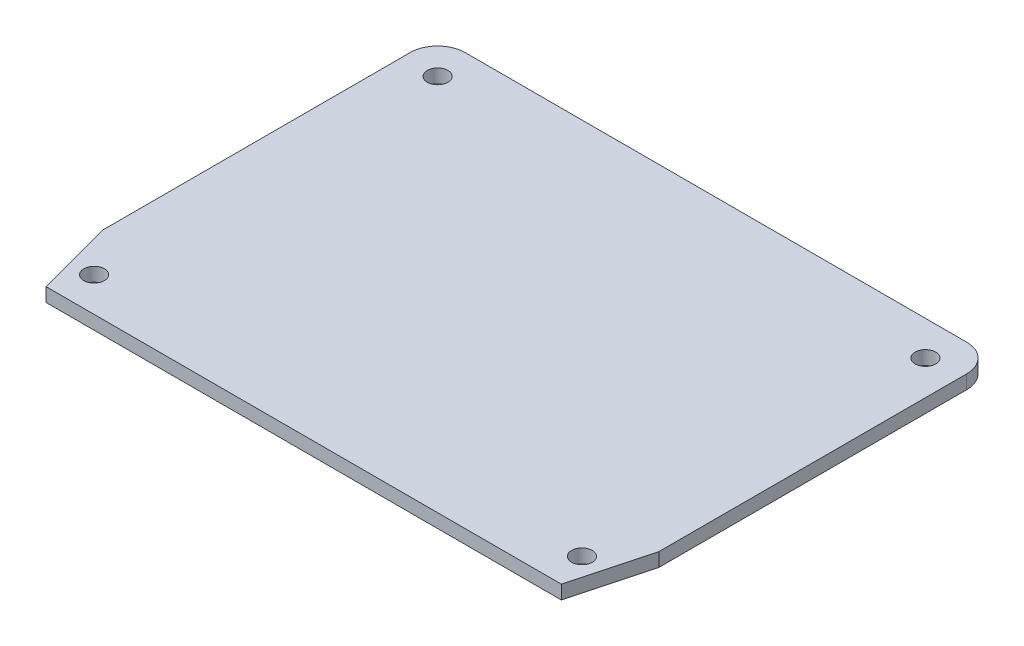
ISO-10303-21;
HEADER;
FILE_DESCRIPTION(('STEP AP214'),'2;1');
FILE_NAME('part.step','',(''),(''),'','','');
FILE_SCHEMA(('AUTOMOTIVE_DESIGN { 1 0 10303 214 1 1 1 1 }'));
ENDSEC;
DATA;
#1=APPLICATION_CONTEXT('core data for automotive mechanical design processes');
#2=APPLICATION_PROTOCOL_DEFINITION('international standard','automotive_design',2000,#1);
#3=PRODUCT_CONTEXT('',#1,'mechanical');
#4=PRODUCT('Part','Part','',(#3));
#5=PRODUCT_RELATED_PRODUCT_CATEGORY('part','',(#4));
#6=PRODUCT_DEFINITION_FORMATION('','',#4);
#7=PRODUCT_DEFINITION_CONTEXT('part definition',#1,'design');
#8=PRODUCT_DEFINITION('design','',#6,#7);
#9=PRODUCT_DEFINITION_SHAPE('','',#8);
#10=(LENGTH_UNIT() NAMED_UNIT(*) SI_UNIT(.MILLI.,.METRE.));
#11=(NAMED_UNIT(*) PLANE_ANGLE_UNIT() SI_UNIT($,.RADIAN.));
#12=(NAMED_UNIT(*) SI_UNIT($,.STERADIAN.) SOLID_ANGLE_UNIT());
#13=UNCERTAINTY_MEASURE_WITH_UNIT(LENGTH_MEASURE(1.E-05),#10,'distance_accuracy_value','');
#14=(GEOMETRIC_REPRESENTATION_CONTEXT(3) GLOBAL_UNCERTAINTY_ASSIGNED_CONTEXT((#13)) GLOBAL_UNIT_ASSIGNED_CONTEXT((#10,
#11,#12)) REPRESENTATION_CONTEXT('',''));
#15=CARTESIAN_POINT('',(0.,0.,0.));
#16=DIRECTION('',(0.,0.,1.));
#17=DIRECTION('',(1.,0.,0.));
#18=AXIS2_PLACEMENT_3D('',#15,#16,#17);
#19=CARTESIAN_POINT('',(40.5,2.,30.));
#20=DIRECTION('',(-1.,0.,0.));
#21=DIRECTION('',(0.,0.,1.));
#22=AXIS2_PLACEMENT_3D('',#19,#20,#21);
#23=PLANE('',#22);
#24=DIRECTION('',(0.,0.,-1.));
#25=VECTOR('',#24,1.);
#26=CARTESIAN_POINT('',(40.5,2.,30.));
#27=LINE('',#26,#25);
#28=CARTESIAN_POINT('',(40.5,2.,18.8038475772934));
#29=VERTEX_POINT('',#28);
#30=CARTESIAN_POINT('',(40.5,2.,-26.));
#31=VERTEX_POINT('',#30);
#32=EDGE_CURVE('E137',#29,#31,#27,.T.);
#33=ORIENTED_EDGE('',*,*,#32,.F.);
#34=DIRECTION('',(0.,-1.,0.));
#35=VECTOR('',#34,1.);
#36=CARTESIAN_POINT('',(40.5,2.,18.8038475772934));
#37=LINE('',#36,#35);
#38=CARTESIAN_POINT('',(40.5,0.,18.8038475772934));
#39=VERTEX_POINT('',#38);
#40=EDGE_CURVE('E161',#29,#39,#37,.T.);
#41=ORIENTED_EDGE('',*,*,#40,.T.);
#42=DIRECTION('',(0.,0.,-1.));
#43=VECTOR('',#42,1.);
#44=CARTESIAN_POINT('',(40.5,0.,30.));
#45=LINE('',#44,#43);
#46=CARTESIAN_POINT('',(40.5,0.,-26.));
#47=VERTEX_POINT('',#46);
#48=EDGE_CURVE('E139',#39,#47,#45,.T.);
#49=ORIENTED_EDGE('',*,*,#48,.T.);
#50=DIRECTION('',(0.,-1.,0.));
#51=VECTOR('',#50,1.);
#52=CARTESIAN_POINT('',(40.5,2.,-26.));
#53=LINE('',#52,#51);
#54=EDGE_CURVE('E157',#47,#31,#53,.F.);
#55=ORIENTED_EDGE('',*,*,#54,.T.);
#56=EDGE_LOOP('',(#33,#41,#49,#55));
#57=FACE_BOUND('',#56,.T.);
#58=ADVANCED_FACE('F45',(#57),#23,.F.);
#59=CARTESIAN_POINT('',(-40.5,2.,-30.));
#60=DIRECTION('',(0.,0.,1.));
#61=DIRECTION('',(1.,0.,0.));
#62=AXIS2_PLACEMENT_3D('',#59,#60,#61);
#63=PLANE('',#62);
#64=DIRECTION('',(-1.,0.,0.));
#65=VECTOR('',#64,1.);
#66=CARTESIAN_POINT('',(-40.5,0.,-30.));
#67=LINE('',#66,#65);
#68=CARTESIAN_POINT('',(36.5,0.,-30.));
#69=VERTEX_POINT('',#68);
#70=CARTESIAN_POINT('',(-36.5,0.,-30.));
#71=VERTEX_POINT('',#70);
#72=EDGE_CURVE('E133',#69,#71,#67,.T.);
#73=ORIENTED_EDGE('',*,*,#72,.T.);
#74=DIRECTION('',(0.,-1.,0.));
#75=VECTOR('',#74,1.);
#76=CARTESIAN_POINT('',(-36.5,2.,-30.));
#77=LINE('',#76,#75);
#78=CARTESIAN_POINT('',(-36.5,2.,-30.));
#79=VERTEX_POINT('',#78);
#80=EDGE_CURVE('E117',#71,#79,#77,.F.);
#81=ORIENTED_EDGE('',*,*,#80,.T.);
#82=DIRECTION('',(-1.,0.,0.));
#83=VECTOR('',#82,1.);
#84=CARTESIAN_POINT('',(-40.5,2.,-30.));
#85=LINE('',#84,#83);
#86=CARTESIAN_POINT('',(36.5,2.,-30.));
#87=VERTEX_POINT('',#86);
#88=EDGE_CURVE('E186',#87,#79,#85,.T.);
#89=ORIENTED_EDGE('',*,*,#88,.F.);
#90=DIRECTION('',(0.,-1.,0.));
#91=VECTOR('',#90,1.);
#92=CARTESIAN_POINT('',(36.5,2.,-30.));
#93=LINE('',#92,#91);
#94=EDGE_CURVE('E121',#87,#69,#93,.T.);
#95=ORIENTED_EDGE('',*,*,#94,.T.);
#96=EDGE_LOOP('',(#73,#81,#89,#95));
#97=FACE_BOUND('',#96,.T.);
#98=ADVANCED_FACE('F259',(#97),#63,.F.);
#99=CARTESIAN_POINT('',(-40.5,2.,30.));
#100=DIRECTION('',(1.,0.,0.));
#101=DIRECTION('',(0.,0.,-1.));
#102=AXIS2_PLACEMENT_3D('',#99,#100,#101);
#103=PLANE('',#102);
#104=DIRECTION('',(0.,0.,1.));
#105=VECTOR('',#104,1.);
#106=CARTESIAN_POINT('',(-40.5,0.,30.));
#107=LINE('',#106,#105);
#108=CARTESIAN_POINT('',(-40.5,0.,-26.));
#109=VERTEX_POINT('',#108);
#110=CARTESIAN_POINT('',(-40.5,0.,18.8038475772934));
#111=VERTEX_POINT('',#110);
#112=EDGE_CURVE('E125',#109,#111,#107,.T.);
#113=ORIENTED_EDGE('',*,*,#112,.T.);
#114=DIRECTION('',(0.,1.,0.));
#115=VECTOR('',#114,1.);
#116=CARTESIAN_POINT('',(-40.5,2.,18.8038475772934));
#117=LINE('',#116,#115);
#118=CARTESIAN_POINT('',(-40.5,2.,18.8038475772934));
#119=VERTEX_POINT('',#118);
#120=EDGE_CURVE('E55',#111,#119,#117,.T.);
#121=ORIENTED_EDGE('',*,*,#120,.T.);
#122=DIRECTION('',(0.,0.,1.));
#123=VECTOR('',#122,1.);
#124=CARTESIAN_POINT('',(-40.5,2.,30.));
#125=LINE('',#124,#123);
#126=CARTESIAN_POINT('',(-40.5,2.,-26.));
#127=VERTEX_POINT('',#126);
#128=EDGE_CURVE('E126',#127,#119,#125,.T.);
#129=ORIENTED_EDGE('',*,*,#128,.F.);
#130=DIRECTION('',(0.,-1.,0.));
#131=VECTOR('',#130,1.);
#132=CARTESIAN_POINT('',(-40.5,2.,-26.));
#133=LINE('',#132,#131);
#134=EDGE_CURVE('E116',#127,#109,#133,.T.);
#135=ORIENTED_EDGE('',*,*,#134,.T.);
#136=EDGE_LOOP('',(#113,#121,#129,#135));
#137=FACE_BOUND('',#136,.T.);
#138=ADVANCED_FACE('F124',(#137),#103,.F.);
#139=CARTESIAN_POINT('',(-40.5,2.,30.));
#140=DIRECTION('',(0.,0.,-1.));
#141=DIRECTION('',(-1.,0.,0.));
#142=AXIS2_PLACEMENT_3D('',#139,#140,#141);
#143=PLANE('',#142);
#144=DIRECTION('',(1.,0.,0.));
#145=VECTOR('',#144,1.);
#146=CARTESIAN_POINT('',(-40.5,2.,30.));
#147=LINE('',#146,#145);
#148=CARTESIAN_POINT('',(-37.5,2.,30.));
#149=VERTEX_POINT('',#148);
#150=CARTESIAN_POINT('',(37.5,2.,30.));
#151=VERTEX_POINT('',#150);
#152=EDGE_CURVE('E128',#149,#151,#147,.T.);
#153=ORIENTED_EDGE('',*,*,#152,.F.);
#154=DIRECTION('',(0.,-1.,0.));
#155=VECTOR('',#154,1.);
#156=CARTESIAN_POINT('',(-37.5,2.,30.));
#157=LINE('',#156,#155);
#158=CARTESIAN_POINT('',(-37.5,0.,30.));
#159=VERTEX_POINT('',#158);
#160=EDGE_CURVE('E176',#149,#159,#157,.T.);
#161=ORIENTED_EDGE('',*,*,#160,.T.);
#162=DIRECTION('',(1.,0.,0.));
#163=VECTOR('',#162,1.);
#164=CARTESIAN_POINT('',(-40.5,0.,30.));
#165=LINE('',#164,#163);
#166=CARTESIAN_POINT('',(37.5,0.,30.));
#167=VERTEX_POINT('',#166);
#168=EDGE_CURVE('E132',#159,#167,#165,.T.);
#169=ORIENTED_EDGE('',*,*,#168,.T.);
#170=DIRECTION('',(0.,1.,0.));
#171=VECTOR('',#170,1.);
#172=CARTESIAN_POINT('',(37.5,2.,30.));
#173=LINE('',#172,#171);
#174=EDGE_CURVE('E169',#167,#151,#173,.T.);
#175=ORIENTED_EDGE('',*,*,#174,.T.);
#176=EDGE_LOOP('',(#153,#161,#169,#175));
#177=FACE_BOUND('',#176,.T.);
#178=ADVANCED_FACE('F238',(#177),#143,.F.);
#179=CARTESIAN_POINT('',(0.,2.,0.));
#180=DIRECTION('',(0.,-1.,0.));
#181=DIRECTION('',(0.,0.,-1.));
#182=AXIS2_PLACEMENT_3D('',#179,#180,#181);
#183=PLANE('',#182);
#184=CARTESIAN_POINT('',(35.5,2.,25.));
#185=DIRECTION('',(0.,1.,0.));
#186=DIRECTION('',(0.,0.,1.));
#187=AXIS2_PLACEMENT_3D('',#184,#185,#186);
#188=CIRCLE('',#187,1.5);
#189=CARTESIAN_POINT('',(35.5,2.,26.5));
#190=VERTEX_POINT('',#189);
#191=EDGE_CURVE('E207',#190,#190,#188,.T.);
#192=ORIENTED_EDGE('',*,*,#191,.F.);
#193=EDGE_LOOP('',(#192));
#194=FACE_BOUND('',#193,.T.);
#195=CARTESIAN_POINT('',(-35.5,2.,-25.));
#196=DIRECTION('',(0.,1.,0.));
#197=DIRECTION('',(0.,0.,1.));
#198=AXIS2_PLACEMENT_3D('',#195,#196,#197);
#199=CIRCLE('',#198,1.5);
#200=CARTESIAN_POINT('',(-35.5,2.,-23.5));
#201=VERTEX_POINT('',#200);
#202=EDGE_CURVE('E213',#201,#201,#199,.T.);
#203=ORIENTED_EDGE('',*,*,#202,.F.);
#204=EDGE_LOOP('',(#203));
#205=FACE_BOUND('',#204,.T.);
#206=CARTESIAN_POINT('',(35.5,2.,-25.));
#207=DIRECTION('',(0.,1.,0.));
#208=DIRECTION('',(0.,0.,1.));
#209=AXIS2_PLACEMENT_3D('',#206,#207,#208);
#210=CIRCLE('',#209,1.5);
#211=CARTESIAN_POINT('',(35.5,2.,-23.5));
#212=VERTEX_POINT('',#211);
#213=EDGE_CURVE('E214',#212,#212,#210,.T.);
#214=ORIENTED_EDGE('',*,*,#213,.F.);
#215=EDGE_LOOP('',(#214));
#216=FACE_BOUND('',#215,.T.);
#217=CARTESIAN_POINT('',(-35.5,2.,25.));
#218=DIRECTION('',(0.,1.,0.));
#219=DIRECTION('',(0.,0.,1.));
#220=AXIS2_PLACEMENT_3D('',#217,#218,#219);
#221=CIRCLE('',#220,1.5);
#222=CARTESIAN_POINT('',(-35.5,2.,26.5));
#223=VERTEX_POINT('',#222);
#224=EDGE_CURVE('E195',#223,#223,#221,.T.);
#225=ORIENTED_EDGE('',*,*,#224,.F.);
#226=EDGE_LOOP('',(#225));
#227=FACE_BOUND('',#226,.T.);
#228=ORIENTED_EDGE('',*,*,#128,.T.);
#229=DIRECTION('',(-0.258819045102521,0.,-0.965925826289068));
#230=VECTOR('',#229,1.);
#231=CARTESIAN_POINT('',(-37.5,2.,30.));
#232=LINE('',#231,#230);
#233=EDGE_CURVE('E11',#119,#149,#232,.F.);
#234=ORIENTED_EDGE('',*,*,#233,.T.);
#235=ORIENTED_EDGE('',*,*,#152,.T.);
#236=DIRECTION('',(-0.258819045102522,0.,0.965925826289068));
#237=VECTOR('',#236,1.);
#238=CARTESIAN_POINT('',(40.5,2.,18.8038475772934));
#239=LINE('',#238,#237);
#240=EDGE_CURVE('E173',#151,#29,#239,.F.);
#241=ORIENTED_EDGE('',*,*,#240,.T.);
#242=ORIENTED_EDGE('',*,*,#32,.T.);
#243=CARTESIAN_POINT('',(36.5,2.,-26.));
#244=DIRECTION('',(0.,-1.,0.));
#245=DIRECTION('',(0.,0.,-1.));
#246=AXIS2_PLACEMENT_3D('',#243,#244,#245);
#247=CIRCLE('',#246,4.);
#248=EDGE_CURVE('E151',#31,#87,#247,.F.);
#249=ORIENTED_EDGE('',*,*,#248,.T.);
#250=ORIENTED_EDGE('',*,*,#88,.T.);
#251=CARTESIAN_POINT('',(-36.5,2.,-26.));
#252=DIRECTION('',(0.,-1.,0.));
#253=DIRECTION('',(0.,0.,-1.));
#254=AXIS2_PLACEMENT_3D('',#251,#252,#253);
#255=CIRCLE('',#254,4.);
#256=EDGE_CURVE('E154',#79,#127,#255,.F.);
#257=ORIENTED_EDGE('',*,*,#256,.T.);
#258=EDGE_LOOP('',(#228,#234,#235,#241,#242,#249,#250,#257));
#259=FACE_BOUND('',#258,.T.);
#260=ADVANCED_FACE('F235',(#194,#205,#216,#227,#259),#183,.F.);
#261=CARTESIAN_POINT('',(0.,0.,0.));
#262=DIRECTION('',(0.,-1.,0.));
#263=DIRECTION('',(0.,0.,-1.));
#264=AXIS2_PLACEMENT_3D('',#261,#262,#263);
#265=PLANE('',#264);
#266=CARTESIAN_POINT('',(35.5,0.,25.));
#267=DIRECTION('',(0.,1.,0.));
#268=DIRECTION('',(0.,0.,1.));
#269=AXIS2_PLACEMENT_3D('',#266,#267,#268);
#270=CIRCLE('',#269,1.5);
#271=CARTESIAN_POINT('',(35.5,0.,26.5));
#272=VERTEX_POINT('',#271);
#273=EDGE_CURVE('E218',#272,#272,#270,.T.);
#274=ORIENTED_EDGE('',*,*,#273,.T.);
#275=EDGE_LOOP('',(#274));
#276=FACE_BOUND('',#275,.T.);
#277=CARTESIAN_POINT('',(-35.5,0.,-25.));
#278=DIRECTION('',(0.,1.,0.));
#279=DIRECTION('',(0.,0.,1.));
#280=AXIS2_PLACEMENT_3D('',#277,#278,#279);
#281=CIRCLE('',#280,1.5);
#282=CARTESIAN_POINT('',(-35.5,0.,-23.5));
#283=VERTEX_POINT('',#282);
#284=EDGE_CURVE('E209',#283,#283,#281,.T.);
#285=ORIENTED_EDGE('',*,*,#284,.T.);
#286=EDGE_LOOP('',(#285));
#287=FACE_BOUND('',#286,.T.);
#288=CARTESIAN_POINT('',(35.5,0.,-25.));
#289=DIRECTION('',(0.,1.,0.));
#290=DIRECTION('',(0.,0.,1.));
#291=AXIS2_PLACEMENT_3D('',#288,#289,#290);
#292=CIRCLE('',#291,1.5);
#293=CARTESIAN_POINT('',(35.5,0.,-23.5));
#294=VERTEX_POINT('',#293);
#295=EDGE_CURVE('E225',#294,#294,#292,.T.);
#296=ORIENTED_EDGE('',*,*,#295,.T.);
#297=EDGE_LOOP('',(#296));
#298=FACE_BOUND('',#297,.T.);
#299=CARTESIAN_POINT('',(-35.5,0.,25.));
#300=DIRECTION('',(0.,1.,0.));
#301=DIRECTION('',(0.,0.,1.));
#302=AXIS2_PLACEMENT_3D('',#299,#300,#301);
#303=CIRCLE('',#302,1.5);
#304=CARTESIAN_POINT('',(-35.5,0.,26.5));
#305=VERTEX_POINT('',#304);
#306=EDGE_CURVE('E198',#305,#305,#303,.T.);
#307=ORIENTED_EDGE('',*,*,#306,.T.);
#308=EDGE_LOOP('',(#307));
#309=FACE_BOUND('',#308,.T.);
#310=ORIENTED_EDGE('',*,*,#168,.F.);
#311=DIRECTION('',(0.258819045102521,0.,0.965925826289068));
#312=VECTOR('',#311,1.);
#313=CARTESIAN_POINT('',(-42.4879763209582,0.,11.3846189432334));
#314=LINE('',#313,#312);
#315=EDGE_CURVE('E69',#159,#111,#314,.F.);
#316=ORIENTED_EDGE('',*,*,#315,.T.);
#317=ORIENTED_EDGE('',*,*,#112,.F.);
#318=CARTESIAN_POINT('',(-36.5,0.,-26.));
#319=DIRECTION('',(0.,-1.,0.));
#320=DIRECTION('',(0.,0.,-1.));
#321=AXIS2_PLACEMENT_3D('',#318,#319,#320);
#322=CIRCLE('',#321,4.);
#323=EDGE_CURVE('E112',#109,#71,#322,.T.);
#324=ORIENTED_EDGE('',*,*,#323,.T.);
#325=ORIENTED_EDGE('',*,*,#72,.F.);
#326=CARTESIAN_POINT('',(36.5,0.,-26.));
#327=DIRECTION('',(0.,-1.,0.));
#328=DIRECTION('',(0.,0.,-1.));
#329=AXIS2_PLACEMENT_3D('',#326,#327,#328);
#330=CIRCLE('',#329,4.);
#331=EDGE_CURVE('E122',#69,#47,#330,.T.);
#332=ORIENTED_EDGE('',*,*,#331,.T.);
#333=ORIENTED_EDGE('',*,*,#48,.F.);
#334=DIRECTION('',(0.258819045102522,0.,-0.965925826289068));
#335=VECTOR('',#334,1.);
#336=CARTESIAN_POINT('',(42.4879763209582,0.,11.3846189432335));
#337=LINE('',#336,#335);
#338=EDGE_CURVE('E165',#39,#167,#337,.F.);
#339=ORIENTED_EDGE('',*,*,#338,.T.);
#340=EDGE_LOOP('',(#310,#316,#317,#324,#325,#332,#333,#339));
#341=FACE_BOUND('',#340,.T.);
#342=ADVANCED_FACE('F130',(#276,#287,#298,#309,#341),#265,.T.);
#343=CARTESIAN_POINT('',(-35.5,0.,25.));
#344=DIRECTION('',(0.,1.,0.));
#345=DIRECTION('',(0.,0.,1.));
#346=AXIS2_PLACEMENT_3D('',#343,#344,#345);
#347=CYLINDRICAL_SURFACE('',#346,1.5);
#348=ORIENTED_EDGE('',*,*,#306,.F.);
#349=EDGE_LOOP('',(#348));
#350=FACE_BOUND('',#349,.T.);
#351=ORIENTED_EDGE('',*,*,#224,.T.);
#352=EDGE_LOOP('',(#351));
#353=FACE_BOUND('',#352,.T.);
#354=ADVANCED_FACE('F294',(#350,#353),#347,.F.);
#355=CARTESIAN_POINT('',(35.5,0.,-25.));
#356=DIRECTION('',(0.,1.,0.));
#357=DIRECTION('',(0.,0.,1.));
#358=AXIS2_PLACEMENT_3D('',#355,#356,#357);
#359=CYLINDRICAL_SURFACE('',#358,1.5);
#360=ORIENTED_EDGE('',*,*,#295,.F.);
#361=EDGE_LOOP('',(#360));
#362=FACE_BOUND('',#361,.T.);
#363=ORIENTED_EDGE('',*,*,#213,.T.);
#364=EDGE_LOOP('',(#363));
#365=FACE_BOUND('',#364,.T.);
#366=ADVANCED_FACE('F233',(#362,#365),#359,.F.);
#367=CARTESIAN_POINT('',(-35.5,0.,-25.));
#368=DIRECTION('',(0.,1.,0.));
#369=DIRECTION('',(0.,0.,1.));
#370=AXIS2_PLACEMENT_3D('',#367,#368,#369);
#371=CYLINDRICAL_SURFACE('',#370,1.5);
#372=ORIENTED_EDGE('',*,*,#284,.F.);
#373=EDGE_LOOP('',(#372));
#374=FACE_BOUND('',#373,.T.);
#375=ORIENTED_EDGE('',*,*,#202,.T.);
#376=EDGE_LOOP('',(#375));
#377=FACE_BOUND('',#376,.T.);
#378=ADVANCED_FACE('F359',(#374,#377),#371,.F.);
#379=CARTESIAN_POINT('',(35.5,0.,25.));
#380=DIRECTION('',(0.,1.,0.));
#381=DIRECTION('',(0.,0.,1.));
#382=AXIS2_PLACEMENT_3D('',#379,#380,#381);
#383=CYLINDRICAL_SURFACE('',#382,1.5);
#384=ORIENTED_EDGE('',*,*,#273,.F.);
#385=EDGE_LOOP('',(#384));
#386=FACE_BOUND('',#385,.T.);
#387=ORIENTED_EDGE('',*,*,#191,.T.);
#388=EDGE_LOOP('',(#387));
#389=FACE_BOUND('',#388,.T.);
#390=ADVANCED_FACE('F272',(#386,#389),#383,.F.);
#391=CARTESIAN_POINT('',(-36.5,2.,-26.));
#392=DIRECTION('',(0.,-1.,0.));
#393=DIRECTION('',(0.,0.,-1.));
#394=AXIS2_PLACEMENT_3D('',#391,#392,#393);
#395=CYLINDRICAL_SURFACE('',#394,4.);
#396=ORIENTED_EDGE('',*,*,#256,.F.);
#397=ORIENTED_EDGE('',*,*,#80,.F.);
#398=ORIENTED_EDGE('',*,*,#323,.F.);
#399=ORIENTED_EDGE('',*,*,#134,.F.);
#400=EDGE_LOOP('',(#396,#397,#398,#399));
#401=FACE_BOUND('',#400,.T.);
#402=ADVANCED_FACE('F115',(#401),#395,.T.);
#403=CARTESIAN_POINT('',(36.5,2.,-26.));
#404=DIRECTION('',(0.,-1.,0.));
#405=DIRECTION('',(0.,0.,-1.));
#406=AXIS2_PLACEMENT_3D('',#403,#404,#405);
#407=CYLINDRICAL_SURFACE('',#406,4.);
#408=ORIENTED_EDGE('',*,*,#248,.F.);
#409=ORIENTED_EDGE('',*,*,#54,.F.);
#410=ORIENTED_EDGE('',*,*,#331,.F.);
#411=ORIENTED_EDGE('',*,*,#94,.F.);
#412=EDGE_LOOP('',(#408,#409,#410,#411));
#413=FACE_BOUND('',#412,.T.);
#414=ADVANCED_FACE('F256',(#413),#407,.T.);
#415=CARTESIAN_POINT('',(40.5,2.,18.8038475772934));
#416=DIRECTION('',(-0.965925826289068,0.,-0.258819045102522));
#417=DIRECTION('',(0.,-1.,0.));
#418=AXIS2_PLACEMENT_3D('',#415,#416,#417);
#419=PLANE('',#418);
#420=ORIENTED_EDGE('',*,*,#240,.F.);
#421=ORIENTED_EDGE('',*,*,#174,.F.);
#422=ORIENTED_EDGE('',*,*,#338,.F.);
#423=ORIENTED_EDGE('',*,*,#40,.F.);
#424=EDGE_LOOP('',(#420,#421,#422,#423));
#425=FACE_BOUND('',#424,.T.);
#426=ADVANCED_FACE('F251',(#425),#419,.F.);
#427=CARTESIAN_POINT('',(-37.5,2.,30.));
#428=DIRECTION('',(0.965925826289068,0.,-0.258819045102521));
#429=DIRECTION('',(0.,-1.,0.));
#430=AXIS2_PLACEMENT_3D('',#427,#428,#429);
#431=PLANE('',#430);
#432=ORIENTED_EDGE('',*,*,#233,.F.);
#433=ORIENTED_EDGE('',*,*,#120,.F.);
#434=ORIENTED_EDGE('',*,*,#315,.F.);
#435=ORIENTED_EDGE('',*,*,#160,.F.);
#436=EDGE_LOOP('',(#432,#433,#434,#435));
#437=FACE_BOUND('',#436,.T.);
#438=ADVANCED_FACE('F48',(#437),#431,.F.);
#439=CLOSED_SHELL('',(#58,#98,#138,#178,#260,#342,#354,#366,#378,#390,#402,#414,#426,#438));
#440=MANIFOLD_SOLID_BREP('B2',#439);
#441=ADVANCED_BREP_SHAPE_REPRESENTATION('',(#18,#440),#14);
#442=SHAPE_DEFINITION_REPRESENTATION(#9,#441);
ENDSEC;
END-ISO-10303-21;
